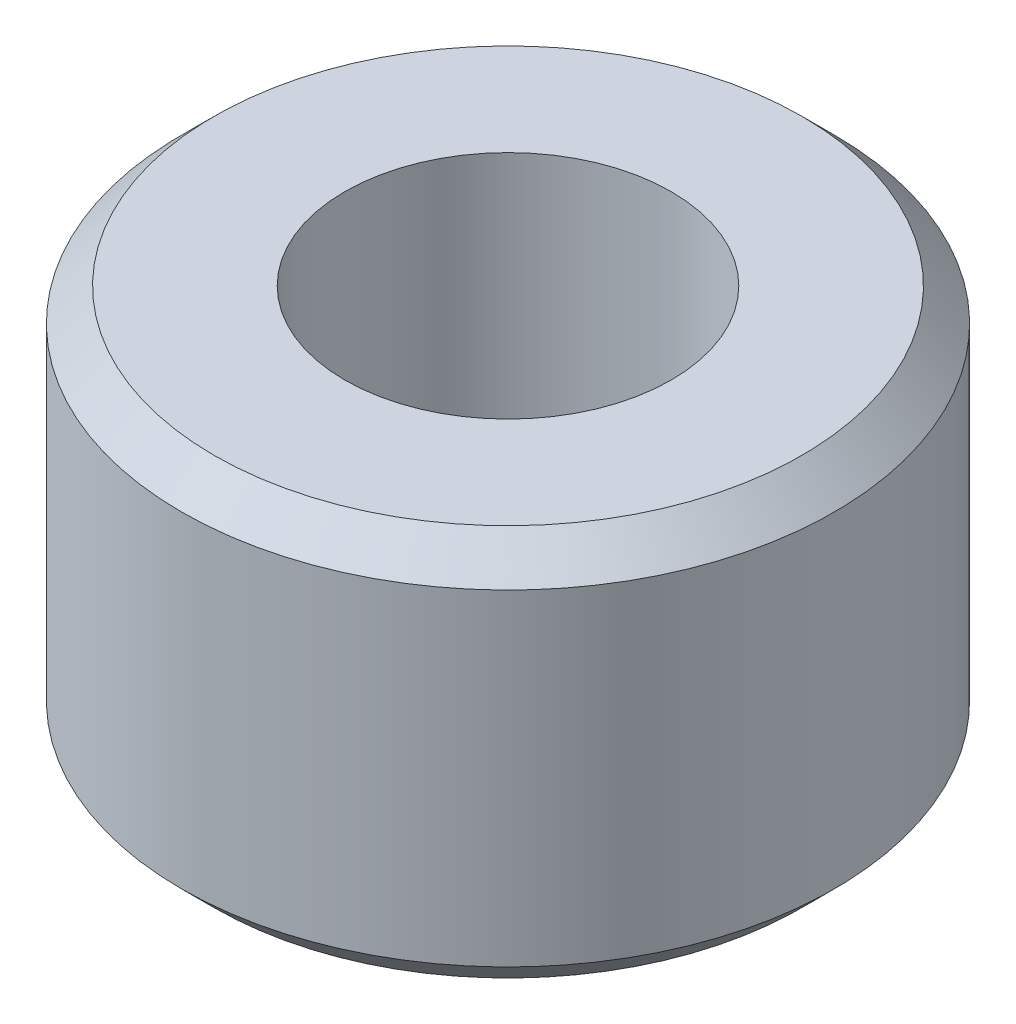
ISO-10303-21;
HEADER;
FILE_DESCRIPTION(('STEP AP214'),'2;1');
FILE_NAME('part.step','',(''),(''),'','','');
FILE_SCHEMA(('AUTOMOTIVE_DESIGN { 1 0 10303 214 1 1 1 1 }'));
ENDSEC;
DATA;
#1=APPLICATION_CONTEXT('core data for automotive mechanical design processes');
#2=APPLICATION_PROTOCOL_DEFINITION('international standard','automotive_design',2000,#1);
#3=PRODUCT_CONTEXT('',#1,'mechanical');
#4=PRODUCT('Part','Part','',(#3));
#5=PRODUCT_RELATED_PRODUCT_CATEGORY('part','',(#4));
#6=PRODUCT_DEFINITION_FORMATION('','',#4);
#7=PRODUCT_DEFINITION_CONTEXT('part definition',#1,'design');
#8=PRODUCT_DEFINITION('design','',#6,#7);
#9=PRODUCT_DEFINITION_SHAPE('','',#8);
#10=(LENGTH_UNIT() NAMED_UNIT(*) SI_UNIT(.MILLI.,.METRE.));
#11=(NAMED_UNIT(*) PLANE_ANGLE_UNIT() SI_UNIT($,.RADIAN.));
#12=(NAMED_UNIT(*) SI_UNIT($,.STERADIAN.) SOLID_ANGLE_UNIT());
#13=UNCERTAINTY_MEASURE_WITH_UNIT(LENGTH_MEASURE(1.E-05),#10,'distance_accuracy_value','');
#14=(GEOMETRIC_REPRESENTATION_CONTEXT(3) GLOBAL_UNCERTAINTY_ASSIGNED_CONTEXT((#13)) GLOBAL_UNIT_ASSIGNED_CONTEXT((#10,
#11,#12)) REPRESENTATION_CONTEXT('',''));
#15=CARTESIAN_POINT('',(0.,0.,0.));
#16=DIRECTION('',(0.,0.,1.));
#17=DIRECTION('',(1.,0.,0.));
#18=AXIS2_PLACEMENT_3D('',#15,#16,#17);
#19=CARTESIAN_POINT('',(0.,7.62,0.));
#20=DIRECTION('',(0.,1.,0.));
#21=DIRECTION('',(0.,0.,1.));
#22=AXIS2_PLACEMENT_3D('',#19,#20,#21);
#23=PLANE('',#22);
#24=CARTESIAN_POINT('',(0.,7.62,0.));
#25=DIRECTION('',(0.,1.,0.));
#26=DIRECTION('',(0.,0.,1.));
#27=AXIS2_PLACEMENT_3D('',#24,#25,#26);
#28=CIRCLE('',#27,5.71500000000002);
#29=CARTESIAN_POINT('',(0.,7.62,-5.71500000000002));
#30=VERTEX_POINT('',#29);
#31=EDGE_CURVE('E10',#30,#30,#28,.T.);
#32=ORIENTED_EDGE('',*,*,#31,.T.);
#33=EDGE_LOOP('',(#32));
#34=FACE_BOUND('',#33,.T.);
#35=CARTESIAN_POINT('',(0.,7.62,0.));
#36=DIRECTION('',(0.,1.,0.));
#37=DIRECTION('',(0.,0.,1.));
#38=AXIS2_PLACEMENT_3D('',#35,#36,#37);
#39=CIRCLE('',#38,3.175);
#40=CARTESIAN_POINT('',(0.,7.62,-3.175));
#41=VERTEX_POINT('',#40);
#42=EDGE_CURVE('E55',#41,#41,#39,.T.);
#43=ORIENTED_EDGE('',*,*,#42,.F.);
#44=EDGE_LOOP('',(#43));
#45=FACE_BOUND('',#44,.T.);
#46=ADVANCED_FACE('F34',(#34,#45),#23,.T.);
#47=CARTESIAN_POINT('',(0.,0.,0.));
#48=DIRECTION('',(0.,1.,0.));
#49=DIRECTION('',(0.,0.,1.));
#50=AXIS2_PLACEMENT_3D('',#47,#48,#49);
#51=PLANE('',#50);
#52=CARTESIAN_POINT('',(0.,0.,0.));
#53=DIRECTION('',(0.,1.,0.));
#54=DIRECTION('',(0.,0.,1.));
#55=AXIS2_PLACEMENT_3D('',#52,#53,#54);
#56=CIRCLE('',#55,5.71499999999999);
#57=CARTESIAN_POINT('',(0.,0.,5.71499999999999));
#58=VERTEX_POINT('',#57);
#59=EDGE_CURVE('E42',#58,#58,#56,.F.);
#60=ORIENTED_EDGE('',*,*,#59,.T.);
#61=EDGE_LOOP('',(#60));
#62=FACE_BOUND('',#61,.T.);
#63=CARTESIAN_POINT('',(0.,0.,0.));
#64=DIRECTION('',(0.,1.,0.));
#65=DIRECTION('',(0.,0.,1.));
#66=AXIS2_PLACEMENT_3D('',#63,#64,#65);
#67=CIRCLE('',#66,3.175);
#68=CARTESIAN_POINT('',(0.,0.,-3.175));
#69=VERTEX_POINT('',#68);
#70=EDGE_CURVE('E56',#69,#69,#67,.T.);
#71=ORIENTED_EDGE('',*,*,#70,.T.);
#72=EDGE_LOOP('',(#71));
#73=FACE_BOUND('',#72,.T.);
#74=ADVANCED_FACE('F66',(#62,#73),#51,.F.);
#75=CARTESIAN_POINT('',(0.,7.62,0.));
#76=DIRECTION('',(0.,-1.,0.));
#77=DIRECTION('',(0.,0.,-1.));
#78=AXIS2_PLACEMENT_3D('',#75,#76,#77);
#79=CYLINDRICAL_SURFACE('',#78,6.35);
#80=CARTESIAN_POINT('',(0.,0.635000000000011,0.));
#81=DIRECTION('',(0.,1.,0.));
#82=DIRECTION('',(0.,0.,1.));
#83=AXIS2_PLACEMENT_3D('',#80,#81,#82);
#84=CIRCLE('',#83,6.35);
#85=CARTESIAN_POINT('',(0.,0.635000000000011,-6.35));
#86=VERTEX_POINT('',#85);
#87=EDGE_CURVE('E46',#86,#86,#84,.T.);
#88=CARTESIAN_POINT('',(0.,6.98500000000002,0.));
#89=DIRECTION('',(0.,1.,0.));
#90=DIRECTION('',(0.,0.,1.));
#91=AXIS2_PLACEMENT_3D('',#88,#89,#90);
#92=CIRCLE('',#91,6.35);
#93=CARTESIAN_POINT('',(0.,6.98500000000002,-6.35));
#94=VERTEX_POINT('',#93);
#95=EDGE_CURVE('E50',#94,#94,#92,.F.);
#96=CARTESIAN_POINT('',(0.,0.635000000000011,-6.35));
#97=CARTESIAN_POINT('',(0.,0.701145833333344,-6.35));
#98=CARTESIAN_POINT('',(0.,0.767291666666677,-6.35));
#99=CARTESIAN_POINT('',(0.,0.899583333333344,-6.35));
#100=CARTESIAN_POINT('',(0.,0.965729166666678,-6.35));
#101=CARTESIAN_POINT('',(0.,1.09802083333334,-6.35));
#102=CARTESIAN_POINT('',(0.,1.16416666666668,-6.35));
#103=CARTESIAN_POINT('',(0.,1.29645833333334,-6.35));
#104=CARTESIAN_POINT('',(0.,1.36260416666668,-6.35));
#105=CARTESIAN_POINT('',(0.,1.49489583333334,-6.35));
#106=CARTESIAN_POINT('',(0.,1.56104166666668,-6.35));
#107=CARTESIAN_POINT('',(0.,1.69333333333334,-6.35));
#108=CARTESIAN_POINT('',(0.,1.75947916666668,-6.35));
#109=CARTESIAN_POINT('',(0.,1.89177083333334,-6.35));
#110=CARTESIAN_POINT('',(0.,1.95791666666668,-6.35));
#111=CARTESIAN_POINT('',(0.,2.09020833333335,-6.35));
#112=CARTESIAN_POINT('',(0.,2.15635416666668,-6.35));
#113=CARTESIAN_POINT('',(0.,2.28864583333335,-6.35));
#114=CARTESIAN_POINT('',(0.,2.35479166666668,-6.35));
#115=CARTESIAN_POINT('',(0.,2.48708333333335,-6.35));
#116=CARTESIAN_POINT('',(0.,2.55322916666668,-6.35));
#117=CARTESIAN_POINT('',(0.,2.68552083333335,-6.35));
#118=CARTESIAN_POINT('',(0.,2.75166666666668,-6.35));
#119=CARTESIAN_POINT('',(0.,2.88395833333335,-6.35));
#120=CARTESIAN_POINT('',(0.,2.95010416666668,-6.35));
#121=CARTESIAN_POINT('',(0.,3.08239583333335,-6.35));
#122=CARTESIAN_POINT('',(0.,3.14854166666668,-6.35));
#123=CARTESIAN_POINT('',(0.,3.28083333333335,-6.35));
#124=CARTESIAN_POINT('',(0.,3.34697916666668,-6.35));
#125=CARTESIAN_POINT('',(0.,3.47927083333335,-6.35));
#126=CARTESIAN_POINT('',(0.,3.54541666666668,-6.35));
#127=CARTESIAN_POINT('',(0.,3.67770833333335,-6.35));
#128=CARTESIAN_POINT('',(0.,3.74385416666668,-6.35));
#129=CARTESIAN_POINT('',(0.,3.87614583333335,-6.35));
#130=CARTESIAN_POINT('',(0.,3.94229166666668,-6.35));
#131=CARTESIAN_POINT('',(0.,4.07458333333335,-6.35));
#132=CARTESIAN_POINT('',(0.,4.14072916666668,-6.35));
#133=CARTESIAN_POINT('',(0.,4.27302083333335,-6.35));
#134=CARTESIAN_POINT('',(0.,4.33916666666668,-6.35));
#135=CARTESIAN_POINT('',(0.,4.47145833333335,-6.35));
#136=CARTESIAN_POINT('',(0.,4.53760416666668,-6.35));
#137=CARTESIAN_POINT('',(0.,4.66989583333335,-6.35));
#138=CARTESIAN_POINT('',(0.,4.73604166666668,-6.35));
#139=CARTESIAN_POINT('',(0.,4.86833333333335,-6.35));
#140=CARTESIAN_POINT('',(0.,4.93447916666668,-6.35));
#141=CARTESIAN_POINT('',(0.,5.06677083333335,-6.35));
#142=CARTESIAN_POINT('',(0.,5.13291666666668,-6.35));
#143=CARTESIAN_POINT('',(0.,5.26520833333335,-6.35));
#144=CARTESIAN_POINT('',(0.,5.33135416666668,-6.35));
#145=CARTESIAN_POINT('',(0.,5.46364583333335,-6.35));
#146=CARTESIAN_POINT('',(0.,5.52979166666668,-6.35));
#147=CARTESIAN_POINT('',(0.,5.66208333333335,-6.35));
#148=CARTESIAN_POINT('',(0.,5.72822916666668,-6.35));
#149=CARTESIAN_POINT('',(0.,5.86052083333335,-6.35));
#150=CARTESIAN_POINT('',(0.,5.92666666666668,-6.35));
#151=CARTESIAN_POINT('',(0.,6.05895833333335,-6.35));
#152=CARTESIAN_POINT('',(0.,6.12510416666668,-6.35));
#153=CARTESIAN_POINT('',(0.,6.25739583333335,-6.35));
#154=CARTESIAN_POINT('',(0.,6.32354166666668,-6.35));
#155=CARTESIAN_POINT('',(0.,6.45583333333335,-6.35));
#156=CARTESIAN_POINT('',(0.,6.52197916666668,-6.35));
#157=CARTESIAN_POINT('',(0.,6.65427083333335,-6.35));
#158=CARTESIAN_POINT('',(0.,6.72041666666668,-6.35));
#159=CARTESIAN_POINT('',(0.,6.85270833333335,-6.35));
#160=CARTESIAN_POINT('',(0.,6.91885416666668,-6.35));
#161=CARTESIAN_POINT('',(0.,6.98500000000002,-6.35));
#162=B_SPLINE_CURVE_WITH_KNOTS('',3,(#96,#97,#98,#99,#100,#101,#102,#103,#104,#105,#106,#107,
#108,#109,#110,#111,#112,#113,#114,#115,#116,#117,#118,#119,#120,#121,#122,#123,#124,#125,#126,
#127,#128,#129,#130,#131,#132,#133,#134,#135,#136,#137,#138,#139,#140,#141,#142,#143,#144,#145,
#146,#147,#148,#149,#150,#151,#152,#153,#154,#155,#156,#157,#158,#159,#160,#161),.UNSPECIFIED.,
.F.,.F.,(4,2,2,2,2,2,2,2,2,2,2,2,2,2,2,2,2,2,2,2,2,2,2,2,2,2,2,2,2,2,2,2,4),(0.,0.1984375,
0.396875000000001,0.5953125,0.793750000000001,0.992187500000001,1.190625,1.3890625,1.5875,
1.7859375,1.984375,2.1828125,2.38125,2.5796875,2.778125,2.9765625,3.175,3.3734375,3.571875,
3.7703125,3.96875,4.1671875,4.365625,4.5640625,4.7625,4.96093750000001,5.159375,5.3578125,
5.55625,5.75468750000001,5.95312500000001,6.15156250000001,6.35000000000001),.UNSPECIFIED.);
#163=EDGE_CURVE('BSEAM71',#86,#94,#162,.T.);
#164=ORIENTED_EDGE('',*,*,#87,.T.);
#165=ORIENTED_EDGE('',*,*,#95,.T.);
#166=ORIENTED_EDGE('',*,*,#163,.T.);
#167=ORIENTED_EDGE('',*,*,#163,.F.);
#168=EDGE_LOOP('',(#164,#166,#165,#167));
#169=FACE_BOUND('',#168,.T.);
#170=ADVANCED_FACE('F71',(#169),#79,.T.);
#171=CARTESIAN_POINT('',(0.,7.62,0.));
#172=DIRECTION('',(0.,-1.,0.));
#173=DIRECTION('',(0.,0.,-1.));
#174=AXIS2_PLACEMENT_3D('',#171,#172,#173);
#175=CYLINDRICAL_SURFACE('',#174,3.175);
#176=CARTESIAN_POINT('',(0.,7.62,-3.175));
#177=CARTESIAN_POINT('',(0.,7.540625,-3.175));
#178=CARTESIAN_POINT('',(0.,7.46125,-3.175));
#179=CARTESIAN_POINT('',(0.,7.3025,-3.175));
#180=CARTESIAN_POINT('',(0.,7.223125,-3.175));
#181=CARTESIAN_POINT('',(0.,7.064375,-3.175));
#182=CARTESIAN_POINT('',(0.,6.985,-3.175));
#183=CARTESIAN_POINT('',(0.,6.82625,-3.175));
#184=CARTESIAN_POINT('',(0.,6.746875,-3.175));
#185=CARTESIAN_POINT('',(0.,6.588125,-3.175));
#186=CARTESIAN_POINT('',(0.,6.50875,-3.175));
#187=CARTESIAN_POINT('',(0.,6.35,-3.175));
#188=CARTESIAN_POINT('',(0.,6.270625,-3.175));
#189=CARTESIAN_POINT('',(0.,6.111875,-3.175));
#190=CARTESIAN_POINT('',(0.,6.0325,-3.175));
#191=CARTESIAN_POINT('',(0.,5.87375,-3.175));
#192=CARTESIAN_POINT('',(0.,5.794375,-3.175));
#193=CARTESIAN_POINT('',(0.,5.635625,-3.175));
#194=CARTESIAN_POINT('',(0.,5.55625,-3.175));
#195=CARTESIAN_POINT('',(0.,5.3975,-3.175));
#196=CARTESIAN_POINT('',(0.,5.318125,-3.175));
#197=CARTESIAN_POINT('',(0.,5.159375,-3.175));
#198=CARTESIAN_POINT('',(0.,5.08,-3.175));
#199=CARTESIAN_POINT('',(0.,4.92125,-3.175));
#200=CARTESIAN_POINT('',(0.,4.841875,-3.175));
#201=CARTESIAN_POINT('',(0.,4.683125,-3.175));
#202=CARTESIAN_POINT('',(0.,4.60375,-3.175));
#203=CARTESIAN_POINT('',(0.,4.445,-3.175));
#204=CARTESIAN_POINT('',(0.,4.365625,-3.175));
#205=CARTESIAN_POINT('',(0.,4.206875,-3.175));
#206=CARTESIAN_POINT('',(0.,4.1275,-3.175));
#207=CARTESIAN_POINT('',(0.,3.96875,-3.175));
#208=CARTESIAN_POINT('',(0.,3.889375,-3.175));
#209=CARTESIAN_POINT('',(0.,3.730625,-3.175));
#210=CARTESIAN_POINT('',(0.,3.65125,-3.175));
#211=CARTESIAN_POINT('',(0.,3.4925,-3.175));
#212=CARTESIAN_POINT('',(0.,3.413125,-3.175));
#213=CARTESIAN_POINT('',(0.,3.254375,-3.175));
#214=CARTESIAN_POINT('',(0.,3.175,-3.175));
#215=CARTESIAN_POINT('',(0.,3.01625,-3.175));
#216=CARTESIAN_POINT('',(0.,2.936875,-3.175));
#217=CARTESIAN_POINT('',(0.,2.778125,-3.175));
#218=CARTESIAN_POINT('',(0.,2.69875,-3.175));
#219=CARTESIAN_POINT('',(0.,2.54,-3.175));
#220=CARTESIAN_POINT('',(0.,2.460625,-3.175));
#221=CARTESIAN_POINT('',(0.,2.301875,-3.175));
#222=CARTESIAN_POINT('',(0.,2.2225,-3.175));
#223=CARTESIAN_POINT('',(0.,2.06375,-3.175));
#224=CARTESIAN_POINT('',(0.,1.984375,-3.175));
#225=CARTESIAN_POINT('',(0.,1.825625,-3.175));
#226=CARTESIAN_POINT('',(0.,1.74625,-3.175));
#227=CARTESIAN_POINT('',(0.,1.5875,-3.175));
#228=CARTESIAN_POINT('',(0.,1.508125,-3.175));
#229=CARTESIAN_POINT('',(0.,1.349375,-3.175));
#230=CARTESIAN_POINT('',(0.,1.27,-3.175));
#231=CARTESIAN_POINT('',(0.,1.11125,-3.175));
#232=CARTESIAN_POINT('',(0.,1.031875,-3.175));
#233=CARTESIAN_POINT('',(0.,0.873125,-3.175));
#234=CARTESIAN_POINT('',(0.,0.79375,-3.175));
#235=CARTESIAN_POINT('',(0.,0.635,-3.175));
#236=CARTESIAN_POINT('',(0.,0.555625,-3.175));
#237=CARTESIAN_POINT('',(0.,0.396875,-3.175));
#238=CARTESIAN_POINT('',(0.,0.3175,-3.175));
#239=CARTESIAN_POINT('',(0.,0.15875,-3.175));
#240=CARTESIAN_POINT('',(0.,0.0793749999999999,-3.175));
#241=CARTESIAN_POINT('',(0.,0.,-3.175));
#242=B_SPLINE_CURVE_WITH_KNOTS('',3,(#176,#177,#178,#179,#180,#181,#182,#183,#184,#185,#186,
#187,#188,#189,#190,#191,#192,#193,#194,#195,#196,#197,#198,#199,#200,#201,#202,#203,#204,#205,
#206,#207,#208,#209,#210,#211,#212,#213,#214,#215,#216,#217,#218,#219,#220,#221,#222,#223,#224,
#225,#226,#227,#228,#229,#230,#231,#232,#233,#234,#235,#236,#237,#238,#239,#240,#241),
.UNSPECIFIED.,.F.,.F.,(4,2,2,2,2,2,2,2,2,2,2,2,2,2,2,2,2,2,2,2,2,2,2,2,2,2,2,2,2,2,2,2,4),(0.,
0.238125,0.47625,0.714375000000001,0.9525,1.190625,1.42875,1.666875,1.905,2.143125,2.38125,
2.619375,2.8575,3.095625,3.33375,3.571875,3.81,4.048125,4.28625,4.524375,4.7625,5.000625,
5.23875,5.476875,5.715,5.953125,6.19125,6.429375,6.6675,6.905625,7.14375,7.381875,7.62),.UNSPECIFIED.);
#243=EDGE_CURVE('BSEAM62',#41,#69,#242,.T.);
#244=ORIENTED_EDGE('',*,*,#42,.T.);
#245=ORIENTED_EDGE('',*,*,#70,.F.);
#246=ORIENTED_EDGE('',*,*,#243,.T.);
#247=ORIENTED_EDGE('',*,*,#243,.F.);
#248=EDGE_LOOP('',(#244,#246,#245,#247));
#249=FACE_BOUND('',#248,.T.);
#250=ADVANCED_FACE('F62',(#249),#175,.F.);
#251=CARTESIAN_POINT('',(0.,0.635000000000011,0.));
#252=DIRECTION('',(0.,1.,0.));
#253=DIRECTION('',(0.,0.,1.));
#254=AXIS2_PLACEMENT_3D('',#251,#252,#253);
#255=CONICAL_SURFACE('',#254,6.35,0.78539816339745);
#256=ORIENTED_EDGE('',*,*,#59,.F.);
#257=EDGE_LOOP('',(#256));
#258=FACE_BOUND('',#257,.T.);
#259=ORIENTED_EDGE('',*,*,#87,.F.);
#260=EDGE_LOOP('',(#259));
#261=FACE_BOUND('',#260,.T.);
#262=ADVANCED_FACE('F78',(#258,#261),#255,.T.);
#263=CARTESIAN_POINT('',(0.,7.62,0.));
#264=DIRECTION('',(0.,-1.,0.));
#265=DIRECTION('',(0.,0.,-1.));
#266=AXIS2_PLACEMENT_3D('',#263,#264,#265);
#267=CONICAL_SURFACE('',#266,5.71500000000002,0.785398163397449);
#268=CARTESIAN_POINT('',(0.,6.98500000000002,-6.35));
#269=CARTESIAN_POINT('',(0.,6.99161458333335,-6.34338541666667));
#270=CARTESIAN_POINT('',(0.,6.99822916666668,-6.33677083333333));
#271=CARTESIAN_POINT('',(0.,7.01145833333335,-6.32354166666667));
#272=CARTESIAN_POINT('',(0.,7.01807291666668,-6.31692708333333));
#273=CARTESIAN_POINT('',(0.,7.03130208333335,-6.30369791666667));
#274=CARTESIAN_POINT('',(0.,7.03791666666668,-6.29708333333333));
#275=CARTESIAN_POINT('',(0.,7.05114583333335,-6.28385416666667));
#276=CARTESIAN_POINT('',(0.,7.05776041666668,-6.27723958333334));
#277=CARTESIAN_POINT('',(0.,7.07098958333335,-6.26401041666667));
#278=CARTESIAN_POINT('',(0.,7.07760416666668,-6.25739583333334));
#279=CARTESIAN_POINT('',(0.,7.09083333333335,-6.24416666666667));
#280=CARTESIAN_POINT('',(0.,7.09744791666668,-6.23755208333334));
#281=CARTESIAN_POINT('',(0.,7.11067708333335,-6.22432291666667));
#282=CARTESIAN_POINT('',(0.,7.11729166666668,-6.21770833333334));
#283=CARTESIAN_POINT('',(0.,7.13052083333335,-6.20447916666667));
#284=CARTESIAN_POINT('',(0.,7.13713541666668,-6.19786458333334));
#285=CARTESIAN_POINT('',(0.,7.15036458333335,-6.18463541666667));
#286=CARTESIAN_POINT('',(0.,7.15697916666668,-6.17802083333334));
#287=CARTESIAN_POINT('',(0.,7.17020833333334,-6.16479166666667));
#288=CARTESIAN_POINT('',(0.,7.17682291666668,-6.15817708333334));
#289=CARTESIAN_POINT('',(0.,7.19005208333334,-6.14494791666667));
#290=CARTESIAN_POINT('',(0.,7.19666666666668,-6.13833333333334));
#291=CARTESIAN_POINT('',(0.,7.20989583333334,-6.12510416666667));
#292=CARTESIAN_POINT('',(0.,7.21651041666668,-6.11848958333334));
#293=CARTESIAN_POINT('',(0.,7.22973958333334,-6.10526041666667));
#294=CARTESIAN_POINT('',(0.,7.23635416666668,-6.09864583333334));
#295=CARTESIAN_POINT('',(0.,7.24958333333334,-6.08541666666667));
#296=CARTESIAN_POINT('',(0.,7.25619791666668,-6.07880208333334));
#297=CARTESIAN_POINT('',(0.,7.26942708333334,-6.06557291666667));
#298=CARTESIAN_POINT('',(0.,7.27604166666667,-6.05895833333334));
#299=CARTESIAN_POINT('',(0.,7.28927083333334,-6.04572916666667));
#300=CARTESIAN_POINT('',(0.,7.29588541666667,-6.03911458333334));
#301=CARTESIAN_POINT('',(0.,7.30911458333334,-6.02588541666668));
#302=CARTESIAN_POINT('',(0.,7.31572916666667,-6.01927083333334));
#303=CARTESIAN_POINT('',(0.,7.32895833333334,-6.00604166666668));
#304=CARTESIAN_POINT('',(0.,7.33557291666667,-5.99942708333334));
#305=CARTESIAN_POINT('',(0.,7.34880208333334,-5.98619791666668));
#306=CARTESIAN_POINT('',(0.,7.35541666666667,-5.97958333333334));
#307=CARTESIAN_POINT('',(0.,7.36864583333334,-5.96635416666668));
#308=CARTESIAN_POINT('',(0.,7.37526041666667,-5.95973958333334));
#309=CARTESIAN_POINT('',(0.,7.38848958333334,-5.94651041666668));
#310=CARTESIAN_POINT('',(0.,7.39510416666667,-5.93989583333334));
#311=CARTESIAN_POINT('',(0.,7.40833333333334,-5.92666666666668));
#312=CARTESIAN_POINT('',(0.,7.41494791666667,-5.92005208333334));
#313=CARTESIAN_POINT('',(0.,7.42817708333334,-5.90682291666668));
#314=CARTESIAN_POINT('',(0.,7.43479166666667,-5.90020833333335));
#315=CARTESIAN_POINT('',(0.,7.44802083333334,-5.88697916666668));
#316=CARTESIAN_POINT('',(0.,7.45463541666667,-5.88036458333335));
#317=CARTESIAN_POINT('',(0.,7.46786458333334,-5.86713541666668));
#318=CARTESIAN_POINT('',(0.,7.47447916666667,-5.86052083333335));
#319=CARTESIAN_POINT('',(0.,7.48770833333334,-5.84729166666668));
#320=CARTESIAN_POINT('',(0.,7.49432291666667,-5.84067708333335));
#321=CARTESIAN_POINT('',(0.,7.50755208333334,-5.82744791666668));
#322=CARTESIAN_POINT('',(0.,7.51416666666667,-5.82083333333335));
#323=CARTESIAN_POINT('',(0.,7.52739583333334,-5.80760416666668));
#324=CARTESIAN_POINT('',(0.,7.53401041666667,-5.80098958333335));
#325=CARTESIAN_POINT('',(0.,7.54723958333333,-5.78776041666668));
#326=CARTESIAN_POINT('',(0.,7.55385416666667,-5.78114583333335));
#327=CARTESIAN_POINT('',(0.,7.56708333333333,-5.76791666666668));
#328=CARTESIAN_POINT('',(0.,7.57369791666667,-5.76130208333335));
#329=CARTESIAN_POINT('',(0.,7.58692708333333,-5.74807291666668));
#330=CARTESIAN_POINT('',(0.,7.59354166666667,-5.74145833333335));
#331=CARTESIAN_POINT('',(0.,7.60677083333333,-5.72822916666668));
#332=CARTESIAN_POINT('',(0.,7.61338541666666,-5.72161458333335));
#333=CARTESIAN_POINT('',(0.,7.62,-5.71500000000002));
#334=B_SPLINE_CURVE_WITH_KNOTS('',3,(#268,#269,#270,#271,#272,#273,#274,#275,#276,#277,#278,
#279,#280,#281,#282,#283,#284,#285,#286,#287,#288,#289,#290,#291,#292,#293,#294,#295,#296,#297,
#298,#299,#300,#301,#302,#303,#304,#305,#306,#307,#308,#309,#310,#311,#312,#313,#314,#315,#316,
#317,#318,#319,#320,#321,#322,#323,#324,#325,#326,#327,#328,#329,#330,#331,#332,#333),
.UNSPECIFIED.,.F.,.F.,(4,2,2,2,2,2,2,2,2,2,2,2,2,2,2,2,2,2,2,2,2,2,2,2,2,2,2,2,2,2,2,2,4),(0.,
0.0280633003783397,0.0561266007566807,0.0841899011350204,0.112253201513361,0.140316501891701,
0.168379802270042,0.196443102648382,0.224506403026723,0.252569703405062,0.280633003783403,
0.308696304161743,0.336759604540084,0.364822904918424,0.392886205296765,0.420949505675104,
0.449012806053445,0.477076106431786,0.505139406810126,0.533202707188466,0.561266007566807,
0.589329307945147,0.617392608323487,0.645455908701828,0.673519209080168,0.701582509458508,
0.729645809836849,0.757709110215189,0.785772410593529,0.813835710971869,0.84189901135021,
0.86996231172855,0.89802561210689),.UNSPECIFIED.);
#335=EDGE_CURVE('BSEAM37',#94,#30,#334,.T.);
#336=ORIENTED_EDGE('',*,*,#95,.F.);
#337=ORIENTED_EDGE('',*,*,#31,.F.);
#338=ORIENTED_EDGE('',*,*,#335,.T.);
#339=ORIENTED_EDGE('',*,*,#335,.F.);
#340=EDGE_LOOP('',(#336,#338,#337,#339));
#341=FACE_BOUND('',#340,.T.);
#342=ADVANCED_FACE('F37',(#341),#267,.T.);
#343=CLOSED_SHELL('',(#46,#74,#170,#250,#262,#342));
#344=MANIFOLD_SOLID_BREP('B2',#343);
#345=ADVANCED_BREP_SHAPE_REPRESENTATION('',(#18,#344),#14);
#346=SHAPE_DEFINITION_REPRESENTATION(#9,#345);
ENDSEC;
END-ISO-10303-21;
